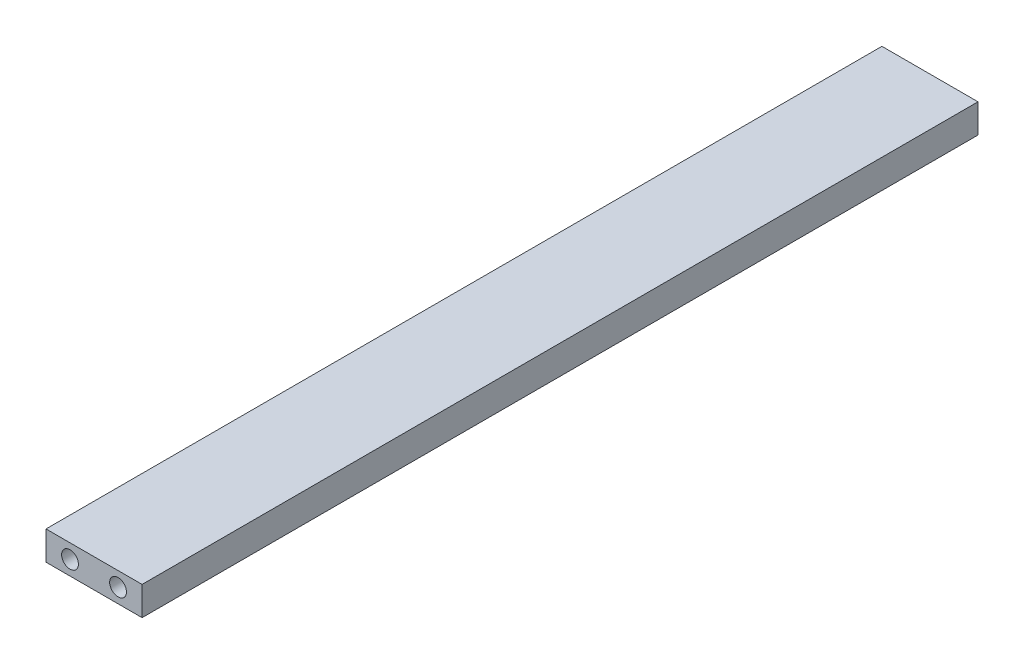
ISO-10303-21;
HEADER;
FILE_DESCRIPTION(('STEP AP214'),'2;1');
FILE_NAME('part.step','',(''),(''),'','','');
FILE_SCHEMA(('AUTOMOTIVE_DESIGN { 1 0 10303 214 1 1 1 1 }'));
ENDSEC;
DATA;
#1=APPLICATION_CONTEXT('core data for automotive mechanical design processes');
#2=APPLICATION_PROTOCOL_DEFINITION('international standard','automotive_design',2000,#1);
#3=PRODUCT_CONTEXT('',#1,'mechanical');
#4=PRODUCT('Part','Part','',(#3));
#5=PRODUCT_RELATED_PRODUCT_CATEGORY('part','',(#4));
#6=PRODUCT_DEFINITION_FORMATION('','',#4);
#7=PRODUCT_DEFINITION_CONTEXT('part definition',#1,'design');
#8=PRODUCT_DEFINITION('design','',#6,#7);
#9=PRODUCT_DEFINITION_SHAPE('','',#8);
#10=(LENGTH_UNIT() NAMED_UNIT(*) SI_UNIT(.MILLI.,.METRE.));
#11=(NAMED_UNIT(*) PLANE_ANGLE_UNIT() SI_UNIT($,.RADIAN.));
#12=(NAMED_UNIT(*) SI_UNIT($,.STERADIAN.) SOLID_ANGLE_UNIT());
#13=UNCERTAINTY_MEASURE_WITH_UNIT(LENGTH_MEASURE(1.E-05),#10,'distance_accuracy_value','');
#14=(GEOMETRIC_REPRESENTATION_CONTEXT(3) GLOBAL_UNCERTAINTY_ASSIGNED_CONTEXT((#13)) GLOBAL_UNIT_ASSIGNED_CONTEXT((#10,
#11,#12)) REPRESENTATION_CONTEXT('',''));
#15=CARTESIAN_POINT('',(0.,0.,0.));
#16=DIRECTION('',(0.,0.,1.));
#17=DIRECTION('',(1.,0.,0.));
#18=AXIS2_PLACEMENT_3D('',#15,#16,#17);
#19=CARTESIAN_POINT('',(-10.,6.,-86.9999999999997));
#20=DIRECTION('',(1.,0.,0.));
#21=DIRECTION('',(0.,0.,-1.));
#22=AXIS2_PLACEMENT_3D('',#19,#20,#21);
#23=PLANE('',#22);
#24=DIRECTION('',(0.,0.,1.));
#25=VECTOR('',#24,1.);
#26=CARTESIAN_POINT('',(-10.,0.,-86.9999999999997));
#27=LINE('',#26,#25);
#28=CARTESIAN_POINT('',(-10.,0.,-86.9999999999997));
#29=VERTEX_POINT('',#28);
#30=CARTESIAN_POINT('',(-10.,0.,86.9999999999997));
#31=VERTEX_POINT('',#30);
#32=EDGE_CURVE('E100',#29,#31,#27,.T.);
#33=ORIENTED_EDGE('',*,*,#32,.T.);
#34=DIRECTION('',(0.,-1.,0.));
#35=VECTOR('',#34,1.);
#36=CARTESIAN_POINT('',(-10.,6.,86.9999999999997));
#37=LINE('',#36,#35);
#38=CARTESIAN_POINT('',(-10.,6.,86.9999999999997));
#39=VERTEX_POINT('',#38);
#40=EDGE_CURVE('E11',#39,#31,#37,.T.);
#41=ORIENTED_EDGE('',*,*,#40,.F.);
#42=DIRECTION('',(0.,0.,1.));
#43=VECTOR('',#42,1.);
#44=CARTESIAN_POINT('',(-10.,6.,-86.9999999999997));
#45=LINE('',#44,#43);
#46=CARTESIAN_POINT('',(-10.,6.,-86.9999999999997));
#47=VERTEX_POINT('',#46);
#48=EDGE_CURVE('E88',#47,#39,#45,.T.);
#49=ORIENTED_EDGE('',*,*,#48,.F.);
#50=DIRECTION('',(0.,-1.,0.));
#51=VECTOR('',#50,1.);
#52=CARTESIAN_POINT('',(-10.,6.,-86.9999999999997));
#53=LINE('',#52,#51);
#54=EDGE_CURVE('E96',#47,#29,#53,.T.);
#55=ORIENTED_EDGE('',*,*,#54,.T.);
#56=EDGE_LOOP('',(#33,#41,#49,#55));
#57=FACE_BOUND('',#56,.T.);
#58=ADVANCED_FACE('F37',(#57),#23,.F.);
#59=CARTESIAN_POINT('',(-10.,6.,86.9999999999997));
#60=DIRECTION('',(0.,0.,-1.));
#61=DIRECTION('',(-1.,0.,0.));
#62=AXIS2_PLACEMENT_3D('',#59,#60,#61);
#63=PLANE('',#62);
#64=CARTESIAN_POINT('',(-5.00000000000097,3.,86.9999999999999));
#65=DIRECTION('',(0.,0.,1.));
#66=DIRECTION('',(1.,0.,0.));
#67=AXIS2_PLACEMENT_3D('',#64,#65,#66);
#68=CIRCLE('',#67,1.75);
#69=CARTESIAN_POINT('',(-3.25000000000097,3.,86.9999999999999));
#70=VERTEX_POINT('',#69);
#71=EDGE_CURVE('E121',#70,#70,#68,.T.);
#72=ORIENTED_EDGE('',*,*,#71,.F.);
#73=EDGE_LOOP('',(#72));
#74=FACE_BOUND('',#73,.T.);
#75=CARTESIAN_POINT('',(4.99999999999903,3.,86.9999999999999));
#76=DIRECTION('',(0.,0.,1.));
#77=DIRECTION('',(-1.,0.,0.));
#78=AXIS2_PLACEMENT_3D('',#75,#76,#77);
#79=CIRCLE('',#78,1.75);
#80=CARTESIAN_POINT('',(3.24999999999903,3.,86.9999999999999));
#81=VERTEX_POINT('',#80);
#82=EDGE_CURVE('E117',#81,#81,#79,.T.);
#83=ORIENTED_EDGE('',*,*,#82,.F.);
#84=EDGE_LOOP('',(#83));
#85=FACE_BOUND('',#84,.T.);
#86=DIRECTION('',(1.,0.,0.));
#87=VECTOR('',#86,1.);
#88=CARTESIAN_POINT('',(-10.,0.,86.9999999999997));
#89=LINE('',#88,#87);
#90=CARTESIAN_POINT('',(10.,0.,87.));
#91=VERTEX_POINT('',#90);
#92=EDGE_CURVE('E92',#31,#91,#89,.T.);
#93=ORIENTED_EDGE('',*,*,#92,.T.);
#94=DIRECTION('',(0.,-1.,0.));
#95=VECTOR('',#94,1.);
#96=CARTESIAN_POINT('',(10.,6.,87.));
#97=LINE('',#96,#95);
#98=CARTESIAN_POINT('',(10.,6.,87.));
#99=VERTEX_POINT('',#98);
#100=EDGE_CURVE('E45',#99,#91,#97,.T.);
#101=ORIENTED_EDGE('',*,*,#100,.F.);
#102=DIRECTION('',(1.,0.,0.));
#103=VECTOR('',#102,1.);
#104=CARTESIAN_POINT('',(-10.,6.,86.9999999999997));
#105=LINE('',#104,#103);
#106=EDGE_CURVE('E83',#39,#99,#105,.T.);
#107=ORIENTED_EDGE('',*,*,#106,.F.);
#108=ORIENTED_EDGE('',*,*,#40,.T.);
#109=EDGE_LOOP('',(#93,#101,#107,#108));
#110=FACE_BOUND('',#109,.T.);
#111=ADVANCED_FACE('F91',(#74,#85,#110),#63,.F.);
#112=CARTESIAN_POINT('',(10.,6.,-86.9999999999997));
#113=DIRECTION('',(-1.,0.,0.));
#114=DIRECTION('',(0.,0.,1.));
#115=AXIS2_PLACEMENT_3D('',#112,#113,#114);
#116=PLANE('',#115);
#117=DIRECTION('',(0.,0.,-1.));
#118=VECTOR('',#117,1.);
#119=CARTESIAN_POINT('',(10.,0.,-86.9999999999997));
#120=LINE('',#119,#118);
#121=CARTESIAN_POINT('',(10.,0.,-86.9999999999997));
#122=VERTEX_POINT('',#121);
#123=EDGE_CURVE('E70',#91,#122,#120,.T.);
#124=ORIENTED_EDGE('',*,*,#123,.T.);
#125=DIRECTION('',(0.,-1.,0.));
#126=VECTOR('',#125,1.);
#127=CARTESIAN_POINT('',(10.,6.,-86.9999999999997));
#128=LINE('',#127,#126);
#129=CARTESIAN_POINT('',(10.,6.,-86.9999999999997));
#130=VERTEX_POINT('',#129);
#131=EDGE_CURVE('E93',#130,#122,#128,.T.);
#132=ORIENTED_EDGE('',*,*,#131,.F.);
#133=DIRECTION('',(0.,0.,-1.));
#134=VECTOR('',#133,1.);
#135=CARTESIAN_POINT('',(10.,6.,-86.9999999999997));
#136=LINE('',#135,#134);
#137=EDGE_CURVE('E86',#99,#130,#136,.T.);
#138=ORIENTED_EDGE('',*,*,#137,.F.);
#139=ORIENTED_EDGE('',*,*,#100,.T.);
#140=EDGE_LOOP('',(#124,#132,#138,#139));
#141=FACE_BOUND('',#140,.T.);
#142=ADVANCED_FACE('F94',(#141),#116,.F.);
#143=CARTESIAN_POINT('',(-10.,6.,-86.9999999999997));
#144=DIRECTION('',(0.,0.,1.));
#145=DIRECTION('',(1.,0.,0.));
#146=AXIS2_PLACEMENT_3D('',#143,#144,#145);
#147=PLANE('',#146);
#148=CARTESIAN_POINT('',(-5.00000000000097,3.,-86.9999999999999));
#149=DIRECTION('',(0.,0.,1.));
#150=DIRECTION('',(1.,0.,0.));
#151=AXIS2_PLACEMENT_3D('',#148,#149,#150);
#152=CIRCLE('',#151,1.75);
#153=CARTESIAN_POINT('',(-3.25000000000097,3.,-86.9999999999999));
#154=VERTEX_POINT('',#153);
#155=EDGE_CURVE('E132',#154,#154,#152,.T.);
#156=ORIENTED_EDGE('',*,*,#155,.T.);
#157=EDGE_LOOP('',(#156));
#158=FACE_BOUND('',#157,.T.);
#159=CARTESIAN_POINT('',(4.99999999999903,3.,-86.9999999999999));
#160=DIRECTION('',(0.,0.,1.));
#161=DIRECTION('',(-1.,0.,0.));
#162=AXIS2_PLACEMENT_3D('',#159,#160,#161);
#163=CIRCLE('',#162,1.75);
#164=CARTESIAN_POINT('',(3.24999999999903,3.,-86.9999999999999));
#165=VERTEX_POINT('',#164);
#166=EDGE_CURVE('E126',#165,#165,#163,.T.);
#167=ORIENTED_EDGE('',*,*,#166,.T.);
#168=EDGE_LOOP('',(#167));
#169=FACE_BOUND('',#168,.T.);
#170=DIRECTION('',(-1.,0.,0.));
#171=VECTOR('',#170,1.);
#172=CARTESIAN_POINT('',(-10.,0.,-86.9999999999997));
#173=LINE('',#172,#171);
#174=EDGE_CURVE('E76',#122,#29,#173,.T.);
#175=ORIENTED_EDGE('',*,*,#174,.T.);
#176=ORIENTED_EDGE('',*,*,#54,.F.);
#177=DIRECTION('',(-1.,0.,0.));
#178=VECTOR('',#177,1.);
#179=CARTESIAN_POINT('',(-10.,6.,-86.9999999999997));
#180=LINE('',#179,#178);
#181=EDGE_CURVE('E53',#130,#47,#180,.T.);
#182=ORIENTED_EDGE('',*,*,#181,.F.);
#183=ORIENTED_EDGE('',*,*,#131,.T.);
#184=EDGE_LOOP('',(#175,#176,#182,#183));
#185=FACE_BOUND('',#184,.T.);
#186=ADVANCED_FACE('F108',(#158,#169,#185),#147,.F.);
#187=CARTESIAN_POINT('',(0.,6.,0.));
#188=DIRECTION('',(0.,1.,0.));
#189=DIRECTION('',(0.,0.,1.));
#190=AXIS2_PLACEMENT_3D('',#187,#188,#189);
#191=PLANE('',#190);
#192=ORIENTED_EDGE('',*,*,#48,.T.);
#193=ORIENTED_EDGE('',*,*,#106,.T.);
#194=ORIENTED_EDGE('',*,*,#137,.T.);
#195=ORIENTED_EDGE('',*,*,#181,.T.);
#196=EDGE_LOOP('',(#192,#193,#194,#195));
#197=FACE_BOUND('',#196,.T.);
#198=ADVANCED_FACE('F84',(#197),#191,.T.);
#199=CARTESIAN_POINT('',(0.,0.,0.));
#200=DIRECTION('',(0.,1.,0.));
#201=DIRECTION('',(0.,0.,1.));
#202=AXIS2_PLACEMENT_3D('',#199,#200,#201);
#203=PLANE('',#202);
#204=ORIENTED_EDGE('',*,*,#32,.F.);
#205=ORIENTED_EDGE('',*,*,#174,.F.);
#206=ORIENTED_EDGE('',*,*,#123,.F.);
#207=ORIENTED_EDGE('',*,*,#92,.F.);
#208=EDGE_LOOP('',(#204,#205,#206,#207));
#209=FACE_BOUND('',#208,.T.);
#210=ADVANCED_FACE('F111',(#209),#203,.F.);
#211=CARTESIAN_POINT('',(4.99999999999903,3.,76.9999999999999));
#212=DIRECTION('',(0.,0.,1.));
#213=DIRECTION('',(1.,0.,0.));
#214=AXIS2_PLACEMENT_3D('',#211,#212,#213);
#215=CYLINDRICAL_SURFACE('',#214,1.75);
#216=CARTESIAN_POINT('',(4.99999999999903,3.,76.9999999999999));
#217=DIRECTION('',(0.,0.,1.));
#218=DIRECTION('',(-1.,0.,0.));
#219=AXIS2_PLACEMENT_3D('',#216,#217,#218);
#220=CIRCLE('',#219,1.75);
#221=CARTESIAN_POINT('',(3.24999999999903,3.,76.9999999999999));
#222=VERTEX_POINT('',#221);
#223=EDGE_CURVE('E114',#222,#222,#220,.T.);
#224=ORIENTED_EDGE('',*,*,#223,.F.);
#225=EDGE_LOOP('',(#224));
#226=FACE_BOUND('',#225,.T.);
#227=ORIENTED_EDGE('',*,*,#82,.T.);
#228=EDGE_LOOP('',(#227));
#229=FACE_BOUND('',#228,.T.);
#230=ADVANCED_FACE('F166',(#226,#229),#215,.F.);
#231=CARTESIAN_POINT('',(4.99999999999903,3.,76.9999999999999));
#232=DIRECTION('',(0.,0.,-1.));
#233=DIRECTION('',(-1.,0.,0.));
#234=AXIS2_PLACEMENT_3D('',#231,#232,#233);
#235=PLANE('',#234);
#236=ORIENTED_EDGE('',*,*,#223,.T.);
#237=EDGE_LOOP('',(#236));
#238=FACE_BOUND('',#237,.T.);
#239=ADVANCED_FACE('F169',(#238),#235,.F.);
#240=CARTESIAN_POINT('',(-5.00000000000097,3.,76.9999999999999));
#241=DIRECTION('',(0.,0.,1.));
#242=DIRECTION('',(1.,0.,0.));
#243=AXIS2_PLACEMENT_3D('',#240,#241,#242);
#244=CYLINDRICAL_SURFACE('',#243,1.75);
#245=CARTESIAN_POINT('',(-5.00000000000097,3.,76.9999999999999));
#246=DIRECTION('',(0.,0.,1.));
#247=DIRECTION('',(1.,0.,0.));
#248=AXIS2_PLACEMENT_3D('',#245,#246,#247);
#249=CIRCLE('',#248,1.75);
#250=CARTESIAN_POINT('',(-3.25000000000097,3.,76.9999999999999));
#251=VERTEX_POINT('',#250);
#252=EDGE_CURVE('E103',#251,#251,#249,.T.);
#253=ORIENTED_EDGE('',*,*,#252,.F.);
#254=EDGE_LOOP('',(#253));
#255=FACE_BOUND('',#254,.T.);
#256=ORIENTED_EDGE('',*,*,#71,.T.);
#257=EDGE_LOOP('',(#256));
#258=FACE_BOUND('',#257,.T.);
#259=ADVANCED_FACE('F172',(#255,#258),#244,.F.);
#260=CARTESIAN_POINT('',(-5.00000000000097,3.,76.9999999999999));
#261=DIRECTION('',(0.,0.,1.));
#262=DIRECTION('',(1.,0.,0.));
#263=AXIS2_PLACEMENT_3D('',#260,#261,#262);
#264=PLANE('',#263);
#265=ORIENTED_EDGE('',*,*,#252,.T.);
#266=EDGE_LOOP('',(#265));
#267=FACE_BOUND('',#266,.T.);
#268=ADVANCED_FACE('F179',(#267),#264,.T.);
#269=CARTESIAN_POINT('',(4.99999999999903,3.,-76.9999999999999));
#270=DIRECTION('',(0.,0.,-1.));
#271=DIRECTION('',(-1.,0.,0.));
#272=AXIS2_PLACEMENT_3D('',#269,#270,#271);
#273=CYLINDRICAL_SURFACE('',#272,1.75);
#274=CARTESIAN_POINT('',(4.99999999999903,3.,-76.9999999999999));
#275=DIRECTION('',(0.,0.,1.));
#276=DIRECTION('',(-1.,0.,0.));
#277=AXIS2_PLACEMENT_3D('',#274,#275,#276);
#278=CIRCLE('',#277,1.75);
#279=CARTESIAN_POINT('',(3.24999999999903,3.,-76.9999999999999));
#280=VERTEX_POINT('',#279);
#281=EDGE_CURVE('E129',#280,#280,#278,.T.);
#282=ORIENTED_EDGE('',*,*,#281,.T.);
#283=EDGE_LOOP('',(#282));
#284=FACE_BOUND('',#283,.T.);
#285=ORIENTED_EDGE('',*,*,#166,.F.);
#286=EDGE_LOOP('',(#285));
#287=FACE_BOUND('',#286,.T.);
#288=ADVANCED_FACE('F183',(#284,#287),#273,.F.);
#289=CARTESIAN_POINT('',(4.99999999999903,3.,-76.9999999999999));
#290=DIRECTION('',(0.,0.,1.));
#291=DIRECTION('',(-1.,0.,0.));
#292=AXIS2_PLACEMENT_3D('',#289,#290,#291);
#293=PLANE('',#292);
#294=ORIENTED_EDGE('',*,*,#281,.F.);
#295=EDGE_LOOP('',(#294));
#296=FACE_BOUND('',#295,.T.);
#297=ADVANCED_FACE('F147',(#296),#293,.F.);
#298=CARTESIAN_POINT('',(-5.00000000000097,3.,-76.9999999999999));
#299=DIRECTION('',(0.,0.,-1.));
#300=DIRECTION('',(-1.,0.,0.));
#301=AXIS2_PLACEMENT_3D('',#298,#299,#300);
#302=CYLINDRICAL_SURFACE('',#301,1.75);
#303=CARTESIAN_POINT('',(-5.00000000000097,3.,-76.9999999999999));
#304=DIRECTION('',(0.,0.,1.));
#305=DIRECTION('',(1.,0.,0.));
#306=AXIS2_PLACEMENT_3D('',#303,#304,#305);
#307=CIRCLE('',#306,1.75);
#308=CARTESIAN_POINT('',(-3.25000000000097,3.,-76.9999999999999));
#309=VERTEX_POINT('',#308);
#310=EDGE_CURVE('E118',#309,#309,#307,.T.);
#311=ORIENTED_EDGE('',*,*,#310,.T.);
#312=EDGE_LOOP('',(#311));
#313=FACE_BOUND('',#312,.T.);
#314=ORIENTED_EDGE('',*,*,#155,.F.);
#315=EDGE_LOOP('',(#314));
#316=FACE_BOUND('',#315,.T.);
#317=ADVANCED_FACE('F138',(#313,#316),#302,.F.);
#318=CARTESIAN_POINT('',(-5.00000000000097,3.,-76.9999999999999));
#319=DIRECTION('',(0.,0.,-1.));
#320=DIRECTION('',(1.,0.,0.));
#321=AXIS2_PLACEMENT_3D('',#318,#319,#320);
#322=PLANE('',#321);
#323=ORIENTED_EDGE('',*,*,#310,.F.);
#324=EDGE_LOOP('',(#323));
#325=FACE_BOUND('',#324,.T.);
#326=ADVANCED_FACE('F141',(#325),#322,.T.);
#327=CLOSED_SHELL('',(#58,#111,#142,#186,#198,#210,#230,#239,#259,#268,#288,#297,#317,#326));
#328=MANIFOLD_SOLID_BREP('B2',#327);
#329=ADVANCED_BREP_SHAPE_REPRESENTATION('',(#18,#328),#14);
#330=SHAPE_DEFINITION_REPRESENTATION(#9,#329);
ENDSEC;
END-ISO-10303-21;
